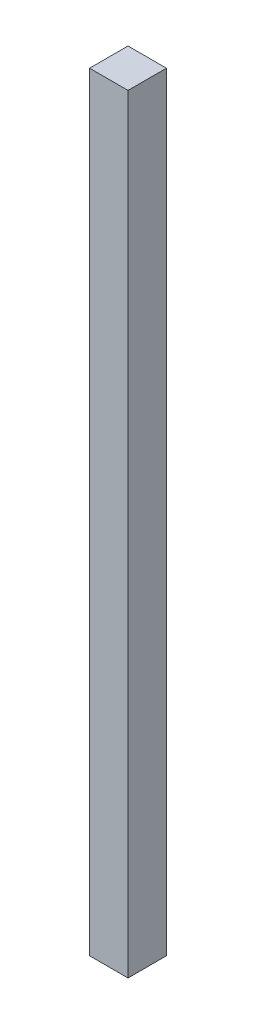
ISO-10303-21;
HEADER;
FILE_DESCRIPTION(('STEP AP214'),'2;1');
FILE_NAME('part.step','',(''),(''),'','','');
FILE_SCHEMA(('AUTOMOTIVE_DESIGN { 1 0 10303 214 1 1 1 1 }'));
ENDSEC;
DATA;
#1=APPLICATION_CONTEXT('core data for automotive mechanical design processes');
#2=APPLICATION_PROTOCOL_DEFINITION('international standard','automotive_design',2000,#1);
#3=PRODUCT_CONTEXT('',#1,'mechanical');
#4=PRODUCT('Part','Part','',(#3));
#5=PRODUCT_RELATED_PRODUCT_CATEGORY('part','',(#4));
#6=PRODUCT_DEFINITION_FORMATION('','',#4);
#7=PRODUCT_DEFINITION_CONTEXT('part definition',#1,'design');
#8=PRODUCT_DEFINITION('design','',#6,#7);
#9=PRODUCT_DEFINITION_SHAPE('','',#8);
#10=(LENGTH_UNIT() NAMED_UNIT(*) SI_UNIT(.MILLI.,.METRE.));
#11=(NAMED_UNIT(*) PLANE_ANGLE_UNIT() SI_UNIT($,.RADIAN.));
#12=(NAMED_UNIT(*) SI_UNIT($,.STERADIAN.) SOLID_ANGLE_UNIT());
#13=UNCERTAINTY_MEASURE_WITH_UNIT(LENGTH_MEASURE(1.E-05),#10,'distance_accuracy_value','');
#14=(GEOMETRIC_REPRESENTATION_CONTEXT(3) GLOBAL_UNCERTAINTY_ASSIGNED_CONTEXT((#13)) GLOBAL_UNIT_ASSIGNED_CONTEXT((#10,
#11,#12)) REPRESENTATION_CONTEXT('',''));
#15=CARTESIAN_POINT('',(0.,0.,0.));
#16=DIRECTION('',(0.,0.,1.));
#17=DIRECTION('',(1.,0.,0.));
#18=AXIS2_PLACEMENT_3D('',#15,#16,#17);
#19=CARTESIAN_POINT('',(2.,40.,0.));
#20=DIRECTION('',(-1.,0.,0.));
#21=DIRECTION('',(0.,0.,1.));
#22=AXIS2_PLACEMENT_3D('',#19,#20,#21);
#23=PLANE('',#22);
#24=DIRECTION('',(0.,0.,-1.));
#25=VECTOR('',#24,1.);
#26=CARTESIAN_POINT('',(2.,0.,0.));
#27=LINE('',#26,#25);
#28=CARTESIAN_POINT('',(2.,0.,2.));
#29=VERTEX_POINT('',#28);
#30=CARTESIAN_POINT('',(2.,0.,0.));
#31=VERTEX_POINT('',#30);
#32=EDGE_CURVE('E113',#29,#31,#27,.T.);
#33=ORIENTED_EDGE('',*,*,#32,.T.);
#34=DIRECTION('',(0.,-1.,0.));
#35=VECTOR('',#34,1.);
#36=CARTESIAN_POINT('',(2.,40.,0.));
#37=LINE('',#36,#35);
#38=CARTESIAN_POINT('',(2.,40.,0.));
#39=VERTEX_POINT('',#38);
#40=EDGE_CURVE('E11',#39,#31,#37,.T.);
#41=ORIENTED_EDGE('',*,*,#40,.F.);
#42=DIRECTION('',(0.,0.,-1.));
#43=VECTOR('',#42,1.);
#44=CARTESIAN_POINT('',(2.,40.,0.));
#45=LINE('',#44,#43);
#46=CARTESIAN_POINT('',(2.,40.,2.));
#47=VERTEX_POINT('',#46);
#48=EDGE_CURVE('E95',#47,#39,#45,.T.);
#49=ORIENTED_EDGE('',*,*,#48,.F.);
#50=DIRECTION('',(0.,-1.,0.));
#51=VECTOR('',#50,1.);
#52=CARTESIAN_POINT('',(2.,40.,2.));
#53=LINE('',#52,#51);
#54=EDGE_CURVE('E109',#47,#29,#53,.T.);
#55=ORIENTED_EDGE('',*,*,#54,.T.);
#56=EDGE_LOOP('',(#33,#41,#49,#55));
#57=FACE_BOUND('',#56,.T.);
#58=ADVANCED_FACE('F43',(#57),#23,.F.);
#59=CARTESIAN_POINT('',(0.,40.,0.));
#60=DIRECTION('',(0.,0.,1.));
#61=DIRECTION('',(1.,0.,0.));
#62=AXIS2_PLACEMENT_3D('',#59,#60,#61);
#63=PLANE('',#62);
#64=DIRECTION('',(-1.,0.,0.));
#65=VECTOR('',#64,1.);
#66=CARTESIAN_POINT('',(0.,0.,0.));
#67=LINE('',#66,#65);
#68=CARTESIAN_POINT('',(0.,0.,0.));
#69=VERTEX_POINT('',#68);
#70=EDGE_CURVE('E100',#31,#69,#67,.T.);
#71=ORIENTED_EDGE('',*,*,#70,.T.);
#72=DIRECTION('',(0.,-1.,0.));
#73=VECTOR('',#72,1.);
#74=CARTESIAN_POINT('',(0.,40.,0.));
#75=LINE('',#74,#73);
#76=CARTESIAN_POINT('',(0.,40.,0.));
#77=VERTEX_POINT('',#76);
#78=EDGE_CURVE('E52',#77,#69,#75,.T.);
#79=ORIENTED_EDGE('',*,*,#78,.F.);
#80=DIRECTION('',(-1.,0.,0.));
#81=VECTOR('',#80,1.);
#82=CARTESIAN_POINT('',(0.,40.,0.));
#83=LINE('',#82,#81);
#84=EDGE_CURVE('E90',#39,#77,#83,.T.);
#85=ORIENTED_EDGE('',*,*,#84,.F.);
#86=ORIENTED_EDGE('',*,*,#40,.T.);
#87=EDGE_LOOP('',(#71,#79,#85,#86));
#88=FACE_BOUND('',#87,.T.);
#89=ADVANCED_FACE('F99',(#88),#63,.F.);
#90=CARTESIAN_POINT('',(0.,40.,0.));
#91=DIRECTION('',(1.,0.,0.));
#92=DIRECTION('',(0.,0.,-1.));
#93=AXIS2_PLACEMENT_3D('',#90,#91,#92);
#94=PLANE('',#93);
#95=DIRECTION('',(0.,0.,1.));
#96=VECTOR('',#95,1.);
#97=CARTESIAN_POINT('',(0.,0.,0.));
#98=LINE('',#97,#96);
#99=CARTESIAN_POINT('',(0.,0.,2.));
#100=VERTEX_POINT('',#99);
#101=EDGE_CURVE('E77',#69,#100,#98,.T.);
#102=ORIENTED_EDGE('',*,*,#101,.T.);
#103=DIRECTION('',(0.,-1.,0.));
#104=VECTOR('',#103,1.);
#105=CARTESIAN_POINT('',(0.,40.,2.));
#106=LINE('',#105,#104);
#107=CARTESIAN_POINT('',(0.,40.,2.));
#108=VERTEX_POINT('',#107);
#109=EDGE_CURVE('E102',#108,#100,#106,.T.);
#110=ORIENTED_EDGE('',*,*,#109,.F.);
#111=DIRECTION('',(0.,0.,1.));
#112=VECTOR('',#111,1.);
#113=CARTESIAN_POINT('',(0.,40.,0.));
#114=LINE('',#113,#112);
#115=EDGE_CURVE('E93',#77,#108,#114,.T.);
#116=ORIENTED_EDGE('',*,*,#115,.F.);
#117=ORIENTED_EDGE('',*,*,#78,.T.);
#118=EDGE_LOOP('',(#102,#110,#116,#117));
#119=FACE_BOUND('',#118,.T.);
#120=ADVANCED_FACE('F103',(#119),#94,.F.);
#121=CARTESIAN_POINT('',(0.,40.,2.));
#122=DIRECTION('',(0.,0.,-1.));
#123=DIRECTION('',(-1.,0.,0.));
#124=AXIS2_PLACEMENT_3D('',#121,#122,#123);
#125=PLANE('',#124);
#126=DIRECTION('',(1.,0.,0.));
#127=VECTOR('',#126,1.);
#128=CARTESIAN_POINT('',(0.,0.,2.));
#129=LINE('',#128,#127);
#130=EDGE_CURVE('E83',#100,#29,#129,.T.);
#131=ORIENTED_EDGE('',*,*,#130,.T.);
#132=ORIENTED_EDGE('',*,*,#54,.F.);
#133=DIRECTION('',(1.,0.,0.));
#134=VECTOR('',#133,1.);
#135=CARTESIAN_POINT('',(0.,40.,2.));
#136=LINE('',#135,#134);
#137=EDGE_CURVE('E60',#108,#47,#136,.T.);
#138=ORIENTED_EDGE('',*,*,#137,.F.);
#139=ORIENTED_EDGE('',*,*,#109,.T.);
#140=EDGE_LOOP('',(#131,#132,#138,#139));
#141=FACE_BOUND('',#140,.T.);
#142=ADVANCED_FACE('F124',(#141),#125,.F.);
#143=CARTESIAN_POINT('',(0.,40.,0.));
#144=DIRECTION('',(0.,1.,0.));
#145=DIRECTION('',(0.,0.,1.));
#146=AXIS2_PLACEMENT_3D('',#143,#144,#145);
#147=PLANE('',#146);
#148=ORIENTED_EDGE('',*,*,#48,.T.);
#149=ORIENTED_EDGE('',*,*,#84,.T.);
#150=ORIENTED_EDGE('',*,*,#115,.T.);
#151=ORIENTED_EDGE('',*,*,#137,.T.);
#152=EDGE_LOOP('',(#148,#149,#150,#151));
#153=FACE_BOUND('',#152,.T.);
#154=ADVANCED_FACE('F91',(#153),#147,.T.);
#155=CARTESIAN_POINT('',(0.,0.,0.));
#156=DIRECTION('',(0.,1.,0.));
#157=DIRECTION('',(0.,0.,1.));
#158=AXIS2_PLACEMENT_3D('',#155,#156,#157);
#159=PLANE('',#158);
#160=ORIENTED_EDGE('',*,*,#32,.F.);
#161=ORIENTED_EDGE('',*,*,#130,.F.);
#162=ORIENTED_EDGE('',*,*,#101,.F.);
#163=ORIENTED_EDGE('',*,*,#70,.F.);
#164=EDGE_LOOP('',(#160,#161,#162,#163));
#165=FACE_BOUND('',#164,.T.);
#166=ADVANCED_FACE('F127',(#165),#159,.F.);
#167=CLOSED_SHELL('',(#58,#89,#120,#142,#154,#166));
#168=MANIFOLD_SOLID_BREP('B2',#167);
#169=ADVANCED_BREP_SHAPE_REPRESENTATION('',(#18,#168),#14);
#170=SHAPE_DEFINITION_REPRESENTATION(#9,#169);
ENDSEC;
END-ISO-10303-21;
